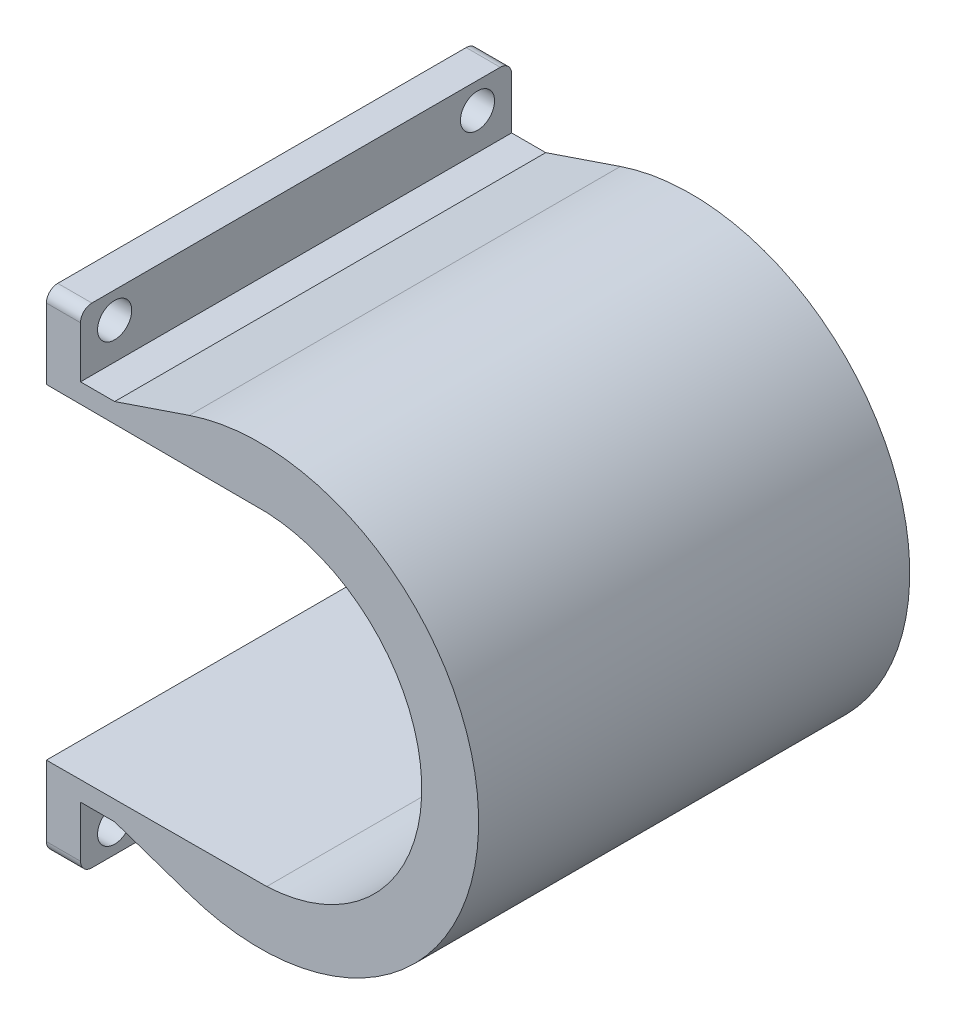
ISO-10303-21;
HEADER;
FILE_DESCRIPTION(('STEP AP214'),'2;1');
FILE_NAME('part.step','',(''),(''),'','','');
FILE_SCHEMA(('AUTOMOTIVE_DESIGN { 1 0 10303 214 1 1 1 1 }'));
ENDSEC;
DATA;
#1=APPLICATION_CONTEXT('core data for automotive mechanical design processes');
#2=APPLICATION_PROTOCOL_DEFINITION('international standard','automotive_design',2000,#1);
#3=PRODUCT_CONTEXT('',#1,'mechanical');
#4=PRODUCT('Part','Part','',(#3));
#5=PRODUCT_RELATED_PRODUCT_CATEGORY('part','',(#4));
#6=PRODUCT_DEFINITION_FORMATION('','',#4);
#7=PRODUCT_DEFINITION_CONTEXT('part definition',#1,'design');
#8=PRODUCT_DEFINITION('design','',#6,#7);
#9=PRODUCT_DEFINITION_SHAPE('','',#8);
#10=(LENGTH_UNIT() NAMED_UNIT(*) SI_UNIT(.MILLI.,.METRE.));
#11=(NAMED_UNIT(*) PLANE_ANGLE_UNIT() SI_UNIT($,.RADIAN.));
#12=(NAMED_UNIT(*) SI_UNIT($,.STERADIAN.) SOLID_ANGLE_UNIT());
#13=UNCERTAINTY_MEASURE_WITH_UNIT(LENGTH_MEASURE(1.E-05),#10,'distance_accuracy_value','');
#14=(GEOMETRIC_REPRESENTATION_CONTEXT(3) GLOBAL_UNCERTAINTY_ASSIGNED_CONTEXT((#13)) GLOBAL_UNIT_ASSIGNED_CONTEXT((#10,
#11,#12)) REPRESENTATION_CONTEXT('',''));
#15=CARTESIAN_POINT('',(0.,0.,0.));
#16=DIRECTION('',(0.,0.,1.));
#17=DIRECTION('',(1.,0.,0.));
#18=AXIS2_PLACEMENT_3D('',#15,#16,#17);
#19=CARTESIAN_POINT('',(0.,0.,37.9));
#20=DIRECTION('',(0.,-1.,0.));
#21=DIRECTION('',(0.,0.,-1.));
#22=AXIS2_PLACEMENT_3D('',#19,#20,#21);
#23=PLANE('',#22);
#24=DIRECTION('',(0.,0.,-1.));
#25=VECTOR('',#24,1.);
#26=CARTESIAN_POINT('',(0.,0.,37.9));
#27=LINE('',#26,#25);
#28=CARTESIAN_POINT('',(0.,0.,36.9));
#29=VERTEX_POINT('',#28);
#30=CARTESIAN_POINT('',(0.,0.,1.));
#31=VERTEX_POINT('',#30);
#32=EDGE_CURVE('E186',#29,#31,#27,.T.);
#33=ORIENTED_EDGE('',*,*,#32,.F.);
#34=DIRECTION('',(-1.,0.,0.));
#35=VECTOR('',#34,1.);
#36=CARTESIAN_POINT('',(3.,0.,36.9));
#37=LINE('',#36,#35);
#38=CARTESIAN_POINT('',(3.,0.,36.9));
#39=VERTEX_POINT('',#38);
#40=EDGE_CURVE('E62',#29,#39,#37,.F.);
#41=ORIENTED_EDGE('',*,*,#40,.T.);
#42=DIRECTION('',(0.,0.,-1.));
#43=VECTOR('',#42,1.);
#44=CARTESIAN_POINT('',(3.,0.,37.9));
#45=LINE('',#44,#43);
#46=CARTESIAN_POINT('',(3.,0.,1.));
#47=VERTEX_POINT('',#46);
#48=EDGE_CURVE('E215',#39,#47,#45,.T.);
#49=ORIENTED_EDGE('',*,*,#48,.T.);
#50=DIRECTION('',(-1.,0.,0.));
#51=VECTOR('',#50,1.);
#52=CARTESIAN_POINT('',(0.,0.,1.));
#53=LINE('',#52,#51);
#54=EDGE_CURVE('E299',#47,#31,#53,.T.);
#55=ORIENTED_EDGE('',*,*,#54,.T.);
#56=EDGE_LOOP('',(#33,#41,#49,#55));
#57=FACE_BOUND('',#56,.T.);
#58=ADVANCED_FACE('F41',(#57),#23,.F.);
#59=CARTESIAN_POINT('',(0.,0.,37.9));
#60=DIRECTION('',(1.,0.,0.));
#61=DIRECTION('',(0.,0.,-1.));
#62=AXIS2_PLACEMENT_3D('',#59,#60,#61);
#63=PLANE('',#62);
#64=CARTESIAN_POINT('',(0.,-2.3,34.9));
#65=DIRECTION('',(-1.,0.,0.));
#66=DIRECTION('',(0.,0.,-1.));
#67=AXIS2_PLACEMENT_3D('',#64,#65,#66);
#68=CIRCLE('',#67,1.5);
#69=CARTESIAN_POINT('',(0.,-2.3,33.4));
#70=VERTEX_POINT('',#69);
#71=EDGE_CURVE('E560',#70,#70,#68,.T.);
#72=ORIENTED_EDGE('',*,*,#71,.F.);
#73=EDGE_LOOP('',(#72));
#74=FACE_BOUND('',#73,.T.);
#75=CARTESIAN_POINT('',(0.,-2.3,3.));
#76=DIRECTION('',(-1.,0.,0.));
#77=DIRECTION('',(0.,0.,1.));
#78=AXIS2_PLACEMENT_3D('',#75,#76,#77);
#79=CIRCLE('',#78,1.5);
#80=CARTESIAN_POINT('',(0.,-2.3,4.5));
#81=VERTEX_POINT('',#80);
#82=EDGE_CURVE('E558',#81,#81,#79,.T.);
#83=ORIENTED_EDGE('',*,*,#82,.F.);
#84=EDGE_LOOP('',(#83));
#85=FACE_BOUND('',#84,.T.);
#86=DIRECTION('',(0.,-1.,0.));
#87=VECTOR('',#86,1.);
#88=CARTESIAN_POINT('',(0.,0.,37.9));
#89=LINE('',#88,#87);
#90=CARTESIAN_POINT('',(0.,-1.,37.9));
#91=VERTEX_POINT('',#90);
#92=CARTESIAN_POINT('',(0.,-7.2,37.9));
#93=VERTEX_POINT('',#92);
#94=EDGE_CURVE('E166',#91,#93,#89,.T.);
#95=ORIENTED_EDGE('',*,*,#94,.F.);
#96=CARTESIAN_POINT('',(0.,-1.,36.9));
#97=DIRECTION('',(1.,0.,0.));
#98=DIRECTION('',(0.,0.,-1.));
#99=AXIS2_PLACEMENT_3D('',#96,#97,#98);
#100=CIRCLE('',#99,1.);
#101=EDGE_CURVE('E297',#91,#29,#100,.F.);
#102=ORIENTED_EDGE('',*,*,#101,.T.);
#103=ORIENTED_EDGE('',*,*,#32,.T.);
#104=CARTESIAN_POINT('',(0.,-1.,1.));
#105=DIRECTION('',(1.,0.,0.));
#106=DIRECTION('',(0.,0.,-1.));
#107=AXIS2_PLACEMENT_3D('',#104,#105,#106);
#108=CIRCLE('',#107,1.);
#109=CARTESIAN_POINT('',(0.,-1.,0.));
#110=VERTEX_POINT('',#109);
#111=EDGE_CURVE('E295',#31,#110,#108,.F.);
#112=ORIENTED_EDGE('',*,*,#111,.T.);
#113=DIRECTION('',(0.,-1.,0.));
#114=VECTOR('',#113,1.);
#115=CARTESIAN_POINT('',(0.,0.,0.));
#116=LINE('',#115,#114);
#117=CARTESIAN_POINT('',(0.,-7.2,0.));
#118=VERTEX_POINT('',#117);
#119=EDGE_CURVE('E183',#110,#118,#116,.T.);
#120=ORIENTED_EDGE('',*,*,#119,.T.);
#121=DIRECTION('',(0.,0.,-1.));
#122=VECTOR('',#121,1.);
#123=CARTESIAN_POINT('',(0.,-7.2,37.9));
#124=LINE('',#123,#122);
#125=EDGE_CURVE('E180',#93,#118,#124,.T.);
#126=ORIENTED_EDGE('',*,*,#125,.F.);
#127=EDGE_LOOP('',(#95,#102,#103,#112,#120,#126));
#128=FACE_BOUND('',#127,.T.);
#129=ADVANCED_FACE('F181',(#74,#85,#128),#63,.F.);
#130=CARTESIAN_POINT('',(0.,-7.2,37.9));
#131=DIRECTION('',(0.00328122499682688,0.999994616766771,0.));
#132=DIRECTION('',(-0.999994616766771,0.00328122499682688,0.));
#133=AXIS2_PLACEMENT_3D('',#130,#131,#132);
#134=PLANE('',#133);
#135=DIRECTION('',(0.99999461676677,-0.00328122499682688,0.));
#136=VECTOR('',#135,1.);
#137=CARTESIAN_POINT('',(0.,-7.2,0.));
#138=LINE('',#137,#136);
#139=CARTESIAN_POINT('',(19.371576269956,-7.26356284245852,0.));
#140=VERTEX_POINT('',#139);
#141=EDGE_CURVE('E217',#118,#140,#138,.T.);
#142=ORIENTED_EDGE('',*,*,#141,.T.);
#143=DIRECTION('',(0.,0.,-1.));
#144=VECTOR('',#143,1.);
#145=CARTESIAN_POINT('',(19.371576269956,-7.26356284245852,37.9));
#146=LINE('',#145,#144);
#147=CARTESIAN_POINT('',(19.371576269956,-7.26356284245852,37.9));
#148=VERTEX_POINT('',#147);
#149=EDGE_CURVE('E187',#148,#140,#146,.T.);
#150=ORIENTED_EDGE('',*,*,#149,.F.);
#151=DIRECTION('',(0.99999461676677,-0.00328122499682688,0.));
#152=VECTOR('',#151,1.);
#153=CARTESIAN_POINT('',(0.,-7.2,37.9));
#154=LINE('',#153,#152);
#155=EDGE_CURVE('E171',#93,#148,#154,.T.);
#156=ORIENTED_EDGE('',*,*,#155,.F.);
#157=ORIENTED_EDGE('',*,*,#125,.T.);
#158=EDGE_LOOP('',(#142,#150,#156,#157));
#159=FACE_BOUND('',#158,.T.);
#160=ADVANCED_FACE('F189',(#159),#134,.F.);
#161=CARTESIAN_POINT('',(18.75,-21.5,37.9));
#162=DIRECTION('',(0.,0.,-1.));
#163=DIRECTION('',(-1.,0.,0.));
#164=AXIS2_PLACEMENT_3D('',#161,#162,#163);
#165=CYLINDRICAL_SURFACE('',#164,14.25);
#166=CARTESIAN_POINT('',(18.75,-21.5,0.));
#167=DIRECTION('',(0.,0.,-1.));
#168=DIRECTION('',(-1.,0.,0.));
#169=AXIS2_PLACEMENT_3D('',#166,#167,#168);
#170=CIRCLE('',#169,14.25);
#171=CARTESIAN_POINT('',(19.371576269956,-35.7364371575415,0.));
#172=VERTEX_POINT('',#171);
#173=EDGE_CURVE('E220',#140,#172,#170,.T.);
#174=ORIENTED_EDGE('',*,*,#173,.T.);
#175=DIRECTION('',(0.,0.,-1.));
#176=VECTOR('',#175,1.);
#177=CARTESIAN_POINT('',(19.371576269956,-35.7364371575415,37.9));
#178=LINE('',#177,#176);
#179=CARTESIAN_POINT('',(19.371576269956,-35.7364371575415,37.9));
#180=VERTEX_POINT('',#179);
#181=EDGE_CURVE('E268',#180,#172,#178,.T.);
#182=ORIENTED_EDGE('',*,*,#181,.F.);
#183=CARTESIAN_POINT('',(18.75,-21.5,37.9));
#184=DIRECTION('',(0.,0.,-1.));
#185=DIRECTION('',(-1.,0.,0.));
#186=AXIS2_PLACEMENT_3D('',#183,#184,#185);
#187=CIRCLE('',#186,14.25);
#188=EDGE_CURVE('E192',#148,#180,#187,.T.);
#189=ORIENTED_EDGE('',*,*,#188,.F.);
#190=ORIENTED_EDGE('',*,*,#149,.T.);
#191=EDGE_LOOP('',(#174,#182,#189,#190));
#192=FACE_BOUND('',#191,.T.);
#193=ADVANCED_FACE('F412',(#192),#165,.F.);
#194=CARTESIAN_POINT('',(0.,-35.8,37.9));
#195=DIRECTION('',(0.00328122499682719,-0.999994616766771,0.));
#196=DIRECTION('',(0.999994616766771,0.00328122499682719,0.));
#197=AXIS2_PLACEMENT_3D('',#194,#195,#196);
#198=PLANE('',#197);
#199=DIRECTION('',(-0.99999461676677,-0.00328122499682719,0.));
#200=VECTOR('',#199,1.);
#201=CARTESIAN_POINT('',(0.,-35.8,0.));
#202=LINE('',#201,#200);
#203=CARTESIAN_POINT('',(0.,-35.8,0.));
#204=VERTEX_POINT('',#203);
#205=EDGE_CURVE('E222',#172,#204,#202,.T.);
#206=ORIENTED_EDGE('',*,*,#205,.T.);
#207=DIRECTION('',(0.,0.,-1.));
#208=VECTOR('',#207,1.);
#209=CARTESIAN_POINT('',(0.,-35.8,37.9));
#210=LINE('',#209,#208);
#211=CARTESIAN_POINT('',(0.,-35.8,37.9));
#212=VERTEX_POINT('',#211);
#213=EDGE_CURVE('E265',#212,#204,#210,.T.);
#214=ORIENTED_EDGE('',*,*,#213,.F.);
#215=DIRECTION('',(-0.99999461676677,-0.00328122499682719,0.));
#216=VECTOR('',#215,1.);
#217=CARTESIAN_POINT('',(0.,-35.8,37.9));
#218=LINE('',#217,#216);
#219=EDGE_CURVE('E194',#180,#212,#218,.T.);
#220=ORIENTED_EDGE('',*,*,#219,.F.);
#221=ORIENTED_EDGE('',*,*,#181,.T.);
#222=EDGE_LOOP('',(#206,#214,#220,#221));
#223=FACE_BOUND('',#222,.T.);
#224=ADVANCED_FACE('F358',(#223),#198,.F.);
#225=CARTESIAN_POINT('',(0.,-43.,37.9));
#226=DIRECTION('',(1.,0.,0.));
#227=DIRECTION('',(0.,1.,0.));
#228=AXIS2_PLACEMENT_3D('',#225,#226,#227);
#229=PLANE('',#228);
#230=CARTESIAN_POINT('',(0.,-40.7,3.));
#231=DIRECTION('',(-1.,0.,0.));
#232=DIRECTION('',(0.,0.,-1.));
#233=AXIS2_PLACEMENT_3D('',#230,#231,#232);
#234=CIRCLE('',#233,1.5);
#235=CARTESIAN_POINT('',(0.,-40.7,1.5));
#236=VERTEX_POINT('',#235);
#237=EDGE_CURVE('E545',#236,#236,#234,.T.);
#238=ORIENTED_EDGE('',*,*,#237,.F.);
#239=EDGE_LOOP('',(#238));
#240=FACE_BOUND('',#239,.T.);
#241=CARTESIAN_POINT('',(0.,-40.7,34.9));
#242=DIRECTION('',(-1.,0.,0.));
#243=DIRECTION('',(0.,0.,1.));
#244=AXIS2_PLACEMENT_3D('',#241,#242,#243);
#245=CIRCLE('',#244,1.5);
#246=CARTESIAN_POINT('',(0.,-40.7,36.4));
#247=VERTEX_POINT('',#246);
#248=EDGE_CURVE('E549',#247,#247,#245,.T.);
#249=ORIENTED_EDGE('',*,*,#248,.F.);
#250=EDGE_LOOP('',(#249));
#251=FACE_BOUND('',#250,.T.);
#252=DIRECTION('',(0.,-1.,0.));
#253=VECTOR('',#252,1.);
#254=CARTESIAN_POINT('',(0.,-43.,0.));
#255=LINE('',#254,#253);
#256=CARTESIAN_POINT('',(0.,-42.,0.));
#257=VERTEX_POINT('',#256);
#258=EDGE_CURVE('E224',#204,#257,#255,.T.);
#259=ORIENTED_EDGE('',*,*,#258,.T.);
#260=CARTESIAN_POINT('',(0.,-42.,1.));
#261=DIRECTION('',(1.,0.,0.));
#262=DIRECTION('',(0.,1.,0.));
#263=AXIS2_PLACEMENT_3D('',#260,#261,#262);
#264=CIRCLE('',#263,1.);
#265=CARTESIAN_POINT('',(0.,-43.,1.));
#266=VERTEX_POINT('',#265);
#267=EDGE_CURVE('E289',#257,#266,#264,.F.);
#268=ORIENTED_EDGE('',*,*,#267,.T.);
#269=DIRECTION('',(0.,0.,-1.));
#270=VECTOR('',#269,1.);
#271=CARTESIAN_POINT('',(0.,-43.,37.9));
#272=LINE('',#271,#270);
#273=CARTESIAN_POINT('',(0.,-43.,36.9));
#274=VERTEX_POINT('',#273);
#275=EDGE_CURVE('E262',#274,#266,#272,.T.);
#276=ORIENTED_EDGE('',*,*,#275,.F.);
#277=CARTESIAN_POINT('',(0.,-42.,36.9));
#278=DIRECTION('',(1.,0.,0.));
#279=DIRECTION('',(0.,1.,0.));
#280=AXIS2_PLACEMENT_3D('',#277,#278,#279);
#281=CIRCLE('',#280,1.);
#282=CARTESIAN_POINT('',(0.,-42.,37.9));
#283=VERTEX_POINT('',#282);
#284=EDGE_CURVE('E287',#274,#283,#281,.F.);
#285=ORIENTED_EDGE('',*,*,#284,.T.);
#286=DIRECTION('',(0.,-1.,0.));
#287=VECTOR('',#286,1.);
#288=CARTESIAN_POINT('',(0.,-43.,37.9));
#289=LINE('',#288,#287);
#290=EDGE_CURVE('E199',#212,#283,#289,.T.);
#291=ORIENTED_EDGE('',*,*,#290,.F.);
#292=ORIENTED_EDGE('',*,*,#213,.T.);
#293=EDGE_LOOP('',(#259,#268,#276,#285,#291,#292));
#294=FACE_BOUND('',#293,.T.);
#295=ADVANCED_FACE('F352',(#240,#251,#294),#229,.F.);
#296=CARTESIAN_POINT('',(0.,-43.,37.9));
#297=DIRECTION('',(0.,1.,0.));
#298=DIRECTION('',(0.,0.,1.));
#299=AXIS2_PLACEMENT_3D('',#296,#297,#298);
#300=PLANE('',#299);
#301=ORIENTED_EDGE('',*,*,#275,.T.);
#302=DIRECTION('',(1.,0.,0.));
#303=VECTOR('',#302,1.);
#304=CARTESIAN_POINT('',(0.,-43.,1.));
#305=LINE('',#304,#303);
#306=CARTESIAN_POINT('',(3.00000000000001,-43.,1.));
#307=VERTEX_POINT('',#306);
#308=EDGE_CURVE('E276',#266,#307,#305,.T.);
#309=ORIENTED_EDGE('',*,*,#308,.T.);
#310=DIRECTION('',(0.,0.,-1.));
#311=VECTOR('',#310,1.);
#312=CARTESIAN_POINT('',(3.00000000000001,-43.,37.9));
#313=LINE('',#312,#311);
#314=CARTESIAN_POINT('',(3.00000000000001,-43.,36.9));
#315=VERTEX_POINT('',#314);
#316=EDGE_CURVE('E259',#315,#307,#313,.T.);
#317=ORIENTED_EDGE('',*,*,#316,.F.);
#318=DIRECTION('',(1.,0.,0.));
#319=VECTOR('',#318,1.);
#320=CARTESIAN_POINT('',(0.,-43.,36.9));
#321=LINE('',#320,#319);
#322=EDGE_CURVE('E274',#315,#274,#321,.F.);
#323=ORIENTED_EDGE('',*,*,#322,.T.);
#324=EDGE_LOOP('',(#301,#309,#317,#323));
#325=FACE_BOUND('',#324,.T.);
#326=ADVANCED_FACE('F367',(#325),#300,.F.);
#327=CARTESIAN_POINT('',(3.00000000000001,-43.,37.9));
#328=DIRECTION('',(-1.,0.,0.));
#329=DIRECTION('',(0.,-1.,0.));
#330=AXIS2_PLACEMENT_3D('',#327,#328,#329);
#331=PLANE('',#330);
#332=CARTESIAN_POINT('',(3.,-40.7,3.));
#333=DIRECTION('',(-1.,0.,0.));
#334=DIRECTION('',(0.,-1.,0.));
#335=AXIS2_PLACEMENT_3D('',#332,#333,#334);
#336=CIRCLE('',#335,1.5);
#337=CARTESIAN_POINT('',(3.,-42.2,3.));
#338=VERTEX_POINT('',#337);
#339=EDGE_CURVE('E548',#338,#338,#336,.F.);
#340=ORIENTED_EDGE('',*,*,#339,.F.);
#341=EDGE_LOOP('',(#340));
#342=FACE_BOUND('',#341,.T.);
#343=CARTESIAN_POINT('',(3.,-40.7,34.9));
#344=DIRECTION('',(-1.,0.,0.));
#345=DIRECTION('',(0.,-1.,0.));
#346=AXIS2_PLACEMENT_3D('',#343,#344,#345);
#347=CIRCLE('',#346,1.5);
#348=CARTESIAN_POINT('',(3.,-42.2,34.9));
#349=VERTEX_POINT('',#348);
#350=EDGE_CURVE('E554',#349,#349,#347,.F.);
#351=ORIENTED_EDGE('',*,*,#350,.F.);
#352=EDGE_LOOP('',(#351));
#353=FACE_BOUND('',#352,.T.);
#354=ORIENTED_EDGE('',*,*,#316,.T.);
#355=CARTESIAN_POINT('',(3.00000000000001,-42.,1.));
#356=DIRECTION('',(-1.,0.,0.));
#357=DIRECTION('',(0.,-1.,0.));
#358=AXIS2_PLACEMENT_3D('',#355,#356,#357);
#359=CIRCLE('',#358,1.);
#360=CARTESIAN_POINT('',(3.00000000000001,-42.,0.));
#361=VERTEX_POINT('',#360);
#362=EDGE_CURVE('E281',#307,#361,#359,.F.);
#363=ORIENTED_EDGE('',*,*,#362,.T.);
#364=DIRECTION('',(0.,1.,0.));
#365=VECTOR('',#364,1.);
#366=CARTESIAN_POINT('',(3.00000000000001,-43.,0.));
#367=LINE('',#366,#365);
#368=CARTESIAN_POINT('',(3.,-37.5,0.));
#369=VERTEX_POINT('',#368);
#370=EDGE_CURVE('E227',#361,#369,#367,.T.);
#371=ORIENTED_EDGE('',*,*,#370,.T.);
#372=DIRECTION('',(0.,0.,-1.));
#373=VECTOR('',#372,1.);
#374=CARTESIAN_POINT('',(3.,-37.5,37.9));
#375=LINE('',#374,#373);
#376=CARTESIAN_POINT('',(3.,-37.5,37.9));
#377=VERTEX_POINT('',#376);
#378=EDGE_CURVE('E256',#377,#369,#375,.T.);
#379=ORIENTED_EDGE('',*,*,#378,.F.);
#380=DIRECTION('',(0.,1.,0.));
#381=VECTOR('',#380,1.);
#382=CARTESIAN_POINT('',(3.00000000000001,-43.,37.9));
#383=LINE('',#382,#381);
#384=CARTESIAN_POINT('',(3.00000000000001,-42.,37.9));
#385=VERTEX_POINT('',#384);
#386=EDGE_CURVE('E201',#385,#377,#383,.T.);
#387=ORIENTED_EDGE('',*,*,#386,.F.);
#388=CARTESIAN_POINT('',(3.00000000000001,-42.,36.9));
#389=DIRECTION('',(-1.,0.,0.));
#390=DIRECTION('',(0.,-1.,0.));
#391=AXIS2_PLACEMENT_3D('',#388,#389,#390);
#392=CIRCLE('',#391,1.);
#393=EDGE_CURVE('E279',#385,#315,#392,.F.);
#394=ORIENTED_EDGE('',*,*,#393,.T.);
#395=EDGE_LOOP('',(#354,#363,#371,#379,#387,#394));
#396=FACE_BOUND('',#395,.T.);
#397=ADVANCED_FACE('F370',(#342,#353,#396),#331,.F.);
#398=CARTESIAN_POINT('',(3.,-37.5,37.9));
#399=DIRECTION('',(0.,1.,0.));
#400=DIRECTION('',(-1.,0.,0.));
#401=AXIS2_PLACEMENT_3D('',#398,#399,#400);
#402=PLANE('',#401);
#403=DIRECTION('',(1.,0.,0.));
#404=VECTOR('',#403,1.);
#405=CARTESIAN_POINT('',(3.,-37.5,0.));
#406=LINE('',#405,#404);
#407=CARTESIAN_POINT('',(6.,-37.5,0.));
#408=VERTEX_POINT('',#407);
#409=EDGE_CURVE('E229',#369,#408,#406,.T.);
#410=ORIENTED_EDGE('',*,*,#409,.T.);
#411=DIRECTION('',(0.,0.,-1.));
#412=VECTOR('',#411,1.);
#413=CARTESIAN_POINT('',(6.,-37.5,37.9));
#414=LINE('',#413,#412);
#415=CARTESIAN_POINT('',(6.,-37.5,37.9));
#416=VERTEX_POINT('',#415);
#417=EDGE_CURVE('E253',#416,#408,#414,.T.);
#418=ORIENTED_EDGE('',*,*,#417,.F.);
#419=DIRECTION('',(1.,0.,0.));
#420=VECTOR('',#419,1.);
#421=CARTESIAN_POINT('',(3.,-37.5,37.9));
#422=LINE('',#421,#420);
#423=EDGE_CURVE('E203',#377,#416,#422,.T.);
#424=ORIENTED_EDGE('',*,*,#423,.F.);
#425=ORIENTED_EDGE('',*,*,#378,.T.);
#426=EDGE_LOOP('',(#410,#418,#424,#425));
#427=FACE_BOUND('',#426,.T.);
#428=ADVANCED_FACE('F377',(#427),#402,.F.);
#429=CARTESIAN_POINT('',(6.,-37.5,37.9));
#430=DIRECTION('',(0.321543970889872,0.946894648197134,0.));
#431=DIRECTION('',(-0.946894648197134,0.321543970889872,0.));
#432=AXIS2_PLACEMENT_3D('',#429,#430,#431);
#433=PLANE('',#432);
#434=DIRECTION('',(0.946894648197134,-0.321543970889872,0.));
#435=VECTOR('',#434,1.);
#436=CARTESIAN_POINT('',(6.,-37.5,0.));
#437=LINE('',#436,#435);
#438=CARTESIAN_POINT('',(12.56027856037,-39.7277219777948,0.));
#439=VERTEX_POINT('',#438);
#440=EDGE_CURVE('E231',#408,#439,#437,.T.);
#441=ORIENTED_EDGE('',*,*,#440,.T.);
#442=DIRECTION('',(0.,0.,-1.));
#443=VECTOR('',#442,1.);
#444=CARTESIAN_POINT('',(12.56027856037,-39.7277219777948,37.9));
#445=LINE('',#444,#443);
#446=CARTESIAN_POINT('',(12.56027856037,-39.7277219777948,37.9));
#447=VERTEX_POINT('',#446);
#448=EDGE_CURVE('E250',#447,#439,#445,.T.);
#449=ORIENTED_EDGE('',*,*,#448,.F.);
#450=DIRECTION('',(0.946894648197134,-0.321543970889872,0.));
#451=VECTOR('',#450,1.);
#452=CARTESIAN_POINT('',(6.,-37.5,37.9));
#453=LINE('',#452,#451);
#454=EDGE_CURVE('E205',#416,#447,#453,.T.);
#455=ORIENTED_EDGE('',*,*,#454,.F.);
#456=ORIENTED_EDGE('',*,*,#417,.T.);
#457=EDGE_LOOP('',(#441,#449,#455,#456));
#458=FACE_BOUND('',#457,.T.);
#459=ADVANCED_FACE('F380',(#458),#433,.F.);
#460=CARTESIAN_POINT('',(18.75,-21.5,37.9));
#461=DIRECTION('',(0.,0.,-1.));
#462=DIRECTION('',(-1.,0.,0.));
#463=AXIS2_PLACEMENT_3D('',#460,#461,#462);
#464=CYLINDRICAL_SURFACE('',#463,19.25);
#465=CARTESIAN_POINT('',(18.75,-21.5,0.));
#466=DIRECTION('',(0.,0.,1.));
#467=DIRECTION('',(1.,0.,0.));
#468=AXIS2_PLACEMENT_3D('',#465,#466,#467);
#469=CIRCLE('',#468,19.25);
#470=CARTESIAN_POINT('',(12.56027856037,-3.27227802220518,0.));
#471=VERTEX_POINT('',#470);
#472=EDGE_CURVE('E233',#439,#471,#469,.T.);
#473=ORIENTED_EDGE('',*,*,#472,.T.);
#474=DIRECTION('',(0.,0.,-1.));
#475=VECTOR('',#474,1.);
#476=CARTESIAN_POINT('',(12.56027856037,-3.27227802220518,37.9));
#477=LINE('',#476,#475);
#478=CARTESIAN_POINT('',(12.56027856037,-3.27227802220518,37.9));
#479=VERTEX_POINT('',#478);
#480=EDGE_CURVE('E247',#479,#471,#477,.T.);
#481=ORIENTED_EDGE('',*,*,#480,.F.);
#482=CARTESIAN_POINT('',(18.75,-21.5,37.9));
#483=DIRECTION('',(0.,0.,1.));
#484=DIRECTION('',(1.,0.,0.));
#485=AXIS2_PLACEMENT_3D('',#482,#483,#484);
#486=CIRCLE('',#485,19.25);
#487=EDGE_CURVE('E207',#447,#479,#486,.T.);
#488=ORIENTED_EDGE('',*,*,#487,.F.);
#489=ORIENTED_EDGE('',*,*,#448,.T.);
#490=EDGE_LOOP('',(#473,#481,#488,#489));
#491=FACE_BOUND('',#490,.T.);
#492=ADVANCED_FACE('F385',(#491),#464,.T.);
#493=CARTESIAN_POINT('',(6.,-5.5,37.9));
#494=DIRECTION('',(0.321543970889871,-0.946894648197134,0.));
#495=DIRECTION('',(0.946894648197134,0.321543970889871,0.));
#496=AXIS2_PLACEMENT_3D('',#493,#494,#495);
#497=PLANE('',#496);
#498=DIRECTION('',(-0.946894648197134,-0.321543970889871,0.));
#499=VECTOR('',#498,1.);
#500=CARTESIAN_POINT('',(6.,-5.5,0.));
#501=LINE('',#500,#499);
#502=CARTESIAN_POINT('',(6.,-5.5,0.));
#503=VERTEX_POINT('',#502);
#504=EDGE_CURVE('E235',#471,#503,#501,.T.);
#505=ORIENTED_EDGE('',*,*,#504,.T.);
#506=DIRECTION('',(0.,0.,-1.));
#507=VECTOR('',#506,1.);
#508=CARTESIAN_POINT('',(6.,-5.5,37.9));
#509=LINE('',#508,#507);
#510=CARTESIAN_POINT('',(6.,-5.5,37.9));
#511=VERTEX_POINT('',#510);
#512=EDGE_CURVE('E244',#511,#503,#509,.T.);
#513=ORIENTED_EDGE('',*,*,#512,.F.);
#514=DIRECTION('',(-0.946894648197134,-0.321543970889871,0.));
#515=VECTOR('',#514,1.);
#516=CARTESIAN_POINT('',(6.,-5.5,37.9));
#517=LINE('',#516,#515);
#518=EDGE_CURVE('E209',#479,#511,#517,.T.);
#519=ORIENTED_EDGE('',*,*,#518,.F.);
#520=ORIENTED_EDGE('',*,*,#480,.T.);
#521=EDGE_LOOP('',(#505,#513,#519,#520));
#522=FACE_BOUND('',#521,.T.);
#523=ADVANCED_FACE('F387',(#522),#497,.F.);
#524=CARTESIAN_POINT('',(3.,-5.5,37.9));
#525=DIRECTION('',(0.,-1.,0.));
#526=DIRECTION('',(0.,0.,-1.));
#527=AXIS2_PLACEMENT_3D('',#524,#525,#526);
#528=PLANE('',#527);
#529=DIRECTION('',(-1.,0.,0.));
#530=VECTOR('',#529,1.);
#531=CARTESIAN_POINT('',(3.,-5.5,0.));
#532=LINE('',#531,#530);
#533=CARTESIAN_POINT('',(3.,-5.5,0.));
#534=VERTEX_POINT('',#533);
#535=EDGE_CURVE('E237',#503,#534,#532,.T.);
#536=ORIENTED_EDGE('',*,*,#535,.T.);
#537=DIRECTION('',(0.,0.,-1.));
#538=VECTOR('',#537,1.);
#539=CARTESIAN_POINT('',(3.,-5.5,37.9));
#540=LINE('',#539,#538);
#541=CARTESIAN_POINT('',(3.,-5.5,37.9));
#542=VERTEX_POINT('',#541);
#543=EDGE_CURVE('E241',#542,#534,#540,.T.);
#544=ORIENTED_EDGE('',*,*,#543,.F.);
#545=DIRECTION('',(-1.,0.,0.));
#546=VECTOR('',#545,1.);
#547=CARTESIAN_POINT('',(3.,-5.5,37.9));
#548=LINE('',#547,#546);
#549=EDGE_CURVE('E211',#511,#542,#548,.T.);
#550=ORIENTED_EDGE('',*,*,#549,.F.);
#551=ORIENTED_EDGE('',*,*,#512,.T.);
#552=EDGE_LOOP('',(#536,#544,#550,#551));
#553=FACE_BOUND('',#552,.T.);
#554=ADVANCED_FACE('F314',(#553),#528,.F.);
#555=CARTESIAN_POINT('',(3.,0.,37.9));
#556=DIRECTION('',(-1.,0.,0.));
#557=DIRECTION('',(0.,-1.,0.));
#558=AXIS2_PLACEMENT_3D('',#555,#556,#557);
#559=PLANE('',#558);
#560=CARTESIAN_POINT('',(3.,-2.3,34.9));
#561=DIRECTION('',(-1.,0.,0.));
#562=DIRECTION('',(0.,-1.,0.));
#563=AXIS2_PLACEMENT_3D('',#560,#561,#562);
#564=CIRCLE('',#563,1.5);
#565=CARTESIAN_POINT('',(3.,-3.8,34.9));
#566=VERTEX_POINT('',#565);
#567=EDGE_CURVE('E551',#566,#566,#564,.F.);
#568=ORIENTED_EDGE('',*,*,#567,.F.);
#569=EDGE_LOOP('',(#568));
#570=FACE_BOUND('',#569,.T.);
#571=CARTESIAN_POINT('',(3.,-2.3,3.));
#572=DIRECTION('',(-1.,0.,0.));
#573=DIRECTION('',(0.,-1.,0.));
#574=AXIS2_PLACEMENT_3D('',#571,#572,#573);
#575=CIRCLE('',#574,1.5);
#576=CARTESIAN_POINT('',(3.,-3.8,3.));
#577=VERTEX_POINT('',#576);
#578=EDGE_CURVE('E218',#577,#577,#575,.F.);
#579=ORIENTED_EDGE('',*,*,#578,.F.);
#580=EDGE_LOOP('',(#579));
#581=FACE_BOUND('',#580,.T.);
#582=ORIENTED_EDGE('',*,*,#48,.F.);
#583=CARTESIAN_POINT('',(3.,-1.,36.9));
#584=DIRECTION('',(-1.,0.,0.));
#585=DIRECTION('',(0.,-1.,0.));
#586=AXIS2_PLACEMENT_3D('',#583,#584,#585);
#587=CIRCLE('',#586,1.);
#588=CARTESIAN_POINT('',(3.,-1.,37.9));
#589=VERTEX_POINT('',#588);
#590=EDGE_CURVE('E11',#39,#589,#587,.F.);
#591=ORIENTED_EDGE('',*,*,#590,.T.);
#592=DIRECTION('',(0.,1.,0.));
#593=VECTOR('',#592,1.);
#594=CARTESIAN_POINT('',(3.,0.,37.9));
#595=LINE('',#594,#593);
#596=EDGE_CURVE('E213',#542,#589,#595,.T.);
#597=ORIENTED_EDGE('',*,*,#596,.F.);
#598=ORIENTED_EDGE('',*,*,#543,.T.);
#599=DIRECTION('',(0.,1.,0.));
#600=VECTOR('',#599,1.);
#601=CARTESIAN_POINT('',(3.,0.,0.));
#602=LINE('',#601,#600);
#603=CARTESIAN_POINT('',(3.,-1.,0.));
#604=VERTEX_POINT('',#603);
#605=EDGE_CURVE('E177',#534,#604,#602,.T.);
#606=ORIENTED_EDGE('',*,*,#605,.T.);
#607=CARTESIAN_POINT('',(3.,-1.,1.));
#608=DIRECTION('',(-1.,0.,0.));
#609=DIRECTION('',(0.,-1.,0.));
#610=AXIS2_PLACEMENT_3D('',#607,#608,#609);
#611=CIRCLE('',#610,1.);
#612=EDGE_CURVE('E49',#604,#47,#611,.F.);
#613=ORIENTED_EDGE('',*,*,#612,.T.);
#614=EDGE_LOOP('',(#582,#591,#597,#598,#606,#613));
#615=FACE_BOUND('',#614,.T.);
#616=ADVANCED_FACE('F308',(#570,#581,#615),#559,.F.);
#617=CARTESIAN_POINT('',(18.75,-21.5,37.9));
#618=DIRECTION('',(0.,0.,1.));
#619=DIRECTION('',(1.,0.,0.));
#620=AXIS2_PLACEMENT_3D('',#617,#618,#619);
#621=PLANE('',#620);
#622=ORIENTED_EDGE('',*,*,#290,.T.);
#623=DIRECTION('',(1.,0.,0.));
#624=VECTOR('',#623,1.);
#625=CARTESIAN_POINT('',(3.00000000000001,-42.,37.9));
#626=LINE('',#625,#624);
#627=EDGE_CURVE('E292',#283,#385,#626,.T.);
#628=ORIENTED_EDGE('',*,*,#627,.T.);
#629=ORIENTED_EDGE('',*,*,#386,.T.);
#630=ORIENTED_EDGE('',*,*,#423,.T.);
#631=ORIENTED_EDGE('',*,*,#454,.T.);
#632=ORIENTED_EDGE('',*,*,#487,.T.);
#633=ORIENTED_EDGE('',*,*,#518,.T.);
#634=ORIENTED_EDGE('',*,*,#549,.T.);
#635=ORIENTED_EDGE('',*,*,#596,.T.);
#636=DIRECTION('',(-1.,0.,0.));
#637=VECTOR('',#636,1.);
#638=CARTESIAN_POINT('',(0.,-1.,37.9));
#639=LINE('',#638,#637);
#640=EDGE_CURVE('E175',#589,#91,#639,.T.);
#641=ORIENTED_EDGE('',*,*,#640,.T.);
#642=ORIENTED_EDGE('',*,*,#94,.T.);
#643=ORIENTED_EDGE('',*,*,#155,.T.);
#644=ORIENTED_EDGE('',*,*,#188,.T.);
#645=ORIENTED_EDGE('',*,*,#219,.T.);
#646=EDGE_LOOP('',(#622,#628,#629,#630,#631,#632,#633,#634,#635,#641,#642,#643,#644,#645));
#647=FACE_BOUND('',#646,.T.);
#648=ADVANCED_FACE('F169',(#647),#621,.T.);
#649=CARTESIAN_POINT('',(18.75,-21.5,0.));
#650=DIRECTION('',(0.,0.,1.));
#651=DIRECTION('',(1.,0.,0.));
#652=AXIS2_PLACEMENT_3D('',#649,#650,#651);
#653=PLANE('',#652);
#654=ORIENTED_EDGE('',*,*,#370,.F.);
#655=DIRECTION('',(1.,0.,0.));
#656=VECTOR('',#655,1.);
#657=CARTESIAN_POINT('',(18.75,-42.,0.));
#658=LINE('',#657,#656);
#659=EDGE_CURVE('E285',#361,#257,#658,.F.);
#660=ORIENTED_EDGE('',*,*,#659,.T.);
#661=ORIENTED_EDGE('',*,*,#258,.F.);
#662=ORIENTED_EDGE('',*,*,#205,.F.);
#663=ORIENTED_EDGE('',*,*,#173,.F.);
#664=ORIENTED_EDGE('',*,*,#141,.F.);
#665=ORIENTED_EDGE('',*,*,#119,.F.);
#666=DIRECTION('',(-1.,0.,0.));
#667=VECTOR('',#666,1.);
#668=CARTESIAN_POINT('',(18.75,-1.,0.));
#669=LINE('',#668,#667);
#670=EDGE_CURVE('E283',#110,#604,#669,.F.);
#671=ORIENTED_EDGE('',*,*,#670,.T.);
#672=ORIENTED_EDGE('',*,*,#605,.F.);
#673=ORIENTED_EDGE('',*,*,#535,.F.);
#674=ORIENTED_EDGE('',*,*,#504,.F.);
#675=ORIENTED_EDGE('',*,*,#472,.F.);
#676=ORIENTED_EDGE('',*,*,#440,.F.);
#677=ORIENTED_EDGE('',*,*,#409,.F.);
#678=EDGE_LOOP('',(#654,#660,#661,#662,#663,#664,#665,#671,#672,#673,#674,#675,#676,#677));
#679=FACE_BOUND('',#678,.T.);
#680=ADVANCED_FACE('F319',(#679),#653,.F.);
#681=CARTESIAN_POINT('',(38.001,-2.3,3.));
#682=DIRECTION('',(-1.,0.,0.));
#683=DIRECTION('',(0.,0.,1.));
#684=AXIS2_PLACEMENT_3D('',#681,#682,#683);
#685=CYLINDRICAL_SURFACE('',#684,1.5);
#686=ORIENTED_EDGE('',*,*,#82,.T.);
#687=EDGE_LOOP('',(#686));
#688=FACE_BOUND('',#687,.T.);
#689=ORIENTED_EDGE('',*,*,#578,.T.);
#690=EDGE_LOOP('',(#689));
#691=FACE_BOUND('',#690,.T.);
#692=ADVANCED_FACE('F483',(#688,#691),#685,.F.);
#693=CARTESIAN_POINT('',(38.001,-2.3,34.9));
#694=DIRECTION('',(-1.,0.,0.));
#695=DIRECTION('',(0.,0.,1.));
#696=AXIS2_PLACEMENT_3D('',#693,#694,#695);
#697=CYLINDRICAL_SURFACE('',#696,1.5);
#698=ORIENTED_EDGE('',*,*,#71,.T.);
#699=EDGE_LOOP('',(#698));
#700=FACE_BOUND('',#699,.T.);
#701=ORIENTED_EDGE('',*,*,#567,.T.);
#702=EDGE_LOOP('',(#701));
#703=FACE_BOUND('',#702,.T.);
#704=ADVANCED_FACE('F491',(#700,#703),#697,.F.);
#705=CARTESIAN_POINT('',(38.001,-40.7,34.9));
#706=DIRECTION('',(-1.,0.,0.));
#707=DIRECTION('',(0.,0.,1.));
#708=AXIS2_PLACEMENT_3D('',#705,#706,#707);
#709=CYLINDRICAL_SURFACE('',#708,1.5);
#710=ORIENTED_EDGE('',*,*,#248,.T.);
#711=EDGE_LOOP('',(#710));
#712=FACE_BOUND('',#711,.T.);
#713=ORIENTED_EDGE('',*,*,#350,.T.);
#714=EDGE_LOOP('',(#713));
#715=FACE_BOUND('',#714,.T.);
#716=ADVANCED_FACE('F501',(#712,#715),#709,.F.);
#717=CARTESIAN_POINT('',(38.001,-40.7,3.));
#718=DIRECTION('',(-1.,0.,0.));
#719=DIRECTION('',(0.,0.,1.));
#720=AXIS2_PLACEMENT_3D('',#717,#718,#719);
#721=CYLINDRICAL_SURFACE('',#720,1.5);
#722=ORIENTED_EDGE('',*,*,#237,.T.);
#723=EDGE_LOOP('',(#722));
#724=FACE_BOUND('',#723,.T.);
#725=ORIENTED_EDGE('',*,*,#339,.T.);
#726=EDGE_LOOP('',(#725));
#727=FACE_BOUND('',#726,.T.);
#728=ADVANCED_FACE('F340',(#724,#727),#721,.F.);
#729=CARTESIAN_POINT('',(0.,-42.,1.));
#730=DIRECTION('',(1.,0.,0.));
#731=DIRECTION('',(0.,0.,-1.));
#732=AXIS2_PLACEMENT_3D('',#729,#730,#731);
#733=CYLINDRICAL_SURFACE('',#732,1.);
#734=ORIENTED_EDGE('',*,*,#267,.F.);
#735=ORIENTED_EDGE('',*,*,#659,.F.);
#736=ORIENTED_EDGE('',*,*,#362,.F.);
#737=ORIENTED_EDGE('',*,*,#308,.F.);
#738=EDGE_LOOP('',(#734,#735,#736,#737));
#739=FACE_BOUND('',#738,.T.);
#740=ADVANCED_FACE('F337',(#739),#733,.T.);
#741=CARTESIAN_POINT('',(18.75,-42.,36.9));
#742=DIRECTION('',(-1.,0.,0.));
#743=DIRECTION('',(0.,0.,1.));
#744=AXIS2_PLACEMENT_3D('',#741,#742,#743);
#745=CYLINDRICAL_SURFACE('',#744,1.);
#746=ORIENTED_EDGE('',*,*,#284,.F.);
#747=ORIENTED_EDGE('',*,*,#322,.F.);
#748=ORIENTED_EDGE('',*,*,#393,.F.);
#749=ORIENTED_EDGE('',*,*,#627,.F.);
#750=EDGE_LOOP('',(#746,#747,#748,#749));
#751=FACE_BOUND('',#750,.T.);
#752=ADVANCED_FACE('F326',(#751),#745,.T.);
#753=CARTESIAN_POINT('',(18.75,-1.,36.9));
#754=DIRECTION('',(1.,0.,0.));
#755=DIRECTION('',(0.,0.,-1.));
#756=AXIS2_PLACEMENT_3D('',#753,#754,#755);
#757=CYLINDRICAL_SURFACE('',#756,1.);
#758=ORIENTED_EDGE('',*,*,#590,.F.);
#759=ORIENTED_EDGE('',*,*,#40,.F.);
#760=ORIENTED_EDGE('',*,*,#101,.F.);
#761=ORIENTED_EDGE('',*,*,#640,.F.);
#762=EDGE_LOOP('',(#758,#759,#760,#761));
#763=FACE_BOUND('',#762,.T.);
#764=ADVANCED_FACE('F306',(#763),#757,.T.);
#765=CARTESIAN_POINT('',(0.,-1.,1.));
#766=DIRECTION('',(-1.,0.,0.));
#767=DIRECTION('',(0.,0.,1.));
#768=AXIS2_PLACEMENT_3D('',#765,#766,#767);
#769=CYLINDRICAL_SURFACE('',#768,1.);
#770=ORIENTED_EDGE('',*,*,#612,.F.);
#771=ORIENTED_EDGE('',*,*,#670,.F.);
#772=ORIENTED_EDGE('',*,*,#111,.F.);
#773=ORIENTED_EDGE('',*,*,#54,.F.);
#774=EDGE_LOOP('',(#770,#771,#772,#773));
#775=FACE_BOUND('',#774,.T.);
#776=ADVANCED_FACE('F43',(#775),#769,.T.);
#777=CLOSED_SHELL('',(#58,#129,#160,#193,#224,#295,#326,#397,#428,#459,#492,#523,#554,#616,#648,
#680,#692,#704,#716,#728,#740,#752,#764,#776));
#778=MANIFOLD_SOLID_BREP('B2',#777);
#779=ADVANCED_BREP_SHAPE_REPRESENTATION('',(#18,#778),#14);
#780=SHAPE_DEFINITION_REPRESENTATION(#9,#779);
ENDSEC;
END-ISO-10303-21;
